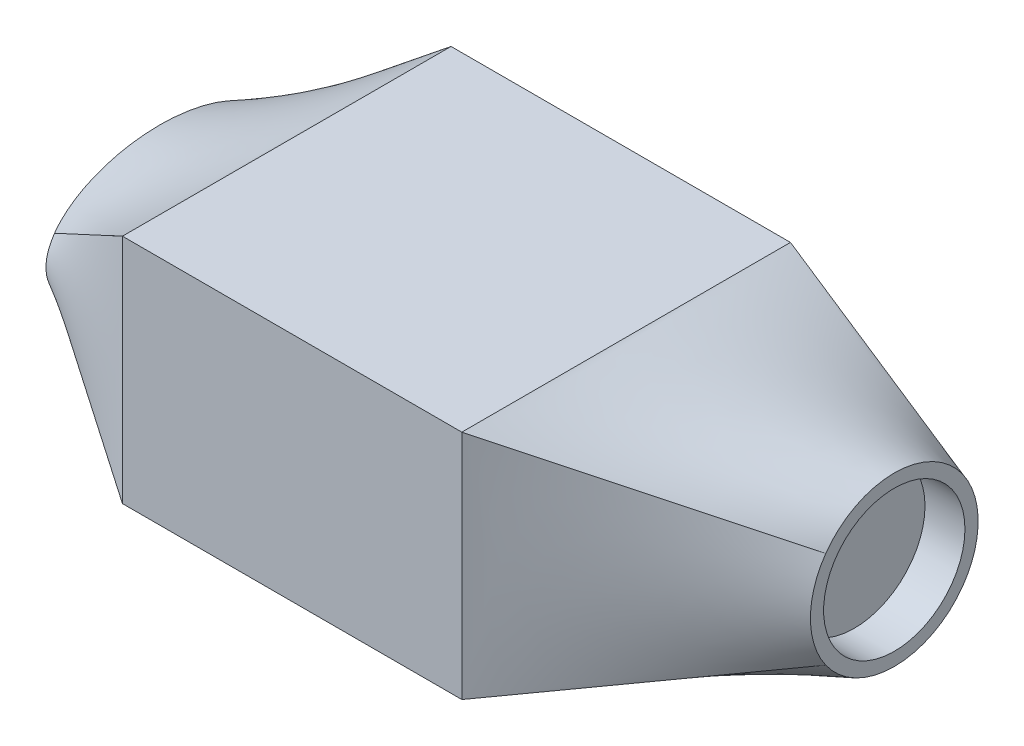
ISO-10303-21;
HEADER;
FILE_DESCRIPTION(('STEP AP214'),'2;1');
FILE_NAME('part.step','',(''),(''),'','','');
FILE_SCHEMA(('AUTOMOTIVE_DESIGN { 1 0 10303 214 1 1 1 1 }'));
ENDSEC;
DATA;
#1=APPLICATION_CONTEXT('core data for automotive mechanical design processes');
#2=APPLICATION_PROTOCOL_DEFINITION('international standard','automotive_design',2000,#1);
#3=PRODUCT_CONTEXT('',#1,'mechanical');
#4=PRODUCT('Part','Part','',(#3));
#5=PRODUCT_RELATED_PRODUCT_CATEGORY('part','',(#4));
#6=PRODUCT_DEFINITION_FORMATION('','',#4);
#7=PRODUCT_DEFINITION_CONTEXT('part definition',#1,'design');
#8=PRODUCT_DEFINITION('design','',#6,#7);
#9=PRODUCT_DEFINITION_SHAPE('','',#8);
#10=(LENGTH_UNIT() NAMED_UNIT(*) SI_UNIT(.MILLI.,.METRE.));
#11=(NAMED_UNIT(*) PLANE_ANGLE_UNIT() SI_UNIT($,.RADIAN.));
#12=(NAMED_UNIT(*) SI_UNIT($,.STERADIAN.) SOLID_ANGLE_UNIT());
#13=UNCERTAINTY_MEASURE_WITH_UNIT(LENGTH_MEASURE(1.E-05),#10,'distance_accuracy_value','');
#14=(GEOMETRIC_REPRESENTATION_CONTEXT(3) GLOBAL_UNCERTAINTY_ASSIGNED_CONTEXT((#13)) GLOBAL_UNIT_ASSIGNED_CONTEXT((#10,
#11,#12)) REPRESENTATION_CONTEXT('',''));
#15=CARTESIAN_POINT('',(0.,0.,0.));
#16=DIRECTION('',(0.,0.,1.));
#17=DIRECTION('',(1.,0.,0.));
#18=AXIS2_PLACEMENT_3D('',#15,#16,#17);
#19=CARTESIAN_POINT('',(0.,14.732,0.));
#20=DIRECTION('',(0.,0.,-1.));
#21=DIRECTION('',(-1.,0.,0.));
#22=AXIS2_PLACEMENT_3D('',#19,#20,#21);
#23=PLANE('',#22);
#24=DIRECTION('',(1.,0.,0.));
#25=VECTOR('',#24,1.);
#26=CARTESIAN_POINT('',(0.,0.,0.));
#27=LINE('',#26,#25);
#28=CARTESIAN_POINT('',(0.,0.,0.));
#29=VERTEX_POINT('',#28);
#30=CARTESIAN_POINT('',(21.59,0.,0.));
#31=VERTEX_POINT('',#30);
#32=EDGE_CURVE('E183',#29,#31,#27,.T.);
#33=ORIENTED_EDGE('',*,*,#32,.T.);
#34=DIRECTION('',(0.,1.,0.));
#35=VECTOR('',#34,1.);
#36=CARTESIAN_POINT('',(21.59,14.732,0.));
#37=LINE('',#36,#35);
#38=CARTESIAN_POINT('',(21.59,14.732,0.));
#39=VERTEX_POINT('',#38);
#40=EDGE_CURVE('E99',#39,#31,#37,.F.);
#41=ORIENTED_EDGE('',*,*,#40,.F.);
#42=DIRECTION('',(1.,0.,0.));
#43=VECTOR('',#42,1.);
#44=CARTESIAN_POINT('',(0.,14.732,0.));
#45=LINE('',#44,#43);
#46=CARTESIAN_POINT('',(0.,14.732,0.));
#47=VERTEX_POINT('',#46);
#48=EDGE_CURVE('E338',#47,#39,#45,.T.);
#49=ORIENTED_EDGE('',*,*,#48,.F.);
#50=DIRECTION('',(0.,1.,0.));
#51=VECTOR('',#50,1.);
#52=CARTESIAN_POINT('',(0.,14.732,0.));
#53=LINE('',#52,#51);
#54=EDGE_CURVE('E12',#47,#29,#53,.F.);
#55=ORIENTED_EDGE('',*,*,#54,.T.);
#56=EDGE_LOOP('',(#33,#41,#49,#55));
#57=FACE_BOUND('',#56,.T.);
#58=ADVANCED_FACE('F90',(#57),#23,.F.);
#59=CARTESIAN_POINT('',(0.,14.732,-20.9042));
#60=DIRECTION('',(0.,0.,1.));
#61=DIRECTION('',(1.,0.,0.));
#62=AXIS2_PLACEMENT_3D('',#59,#60,#61);
#63=PLANE('',#62);
#64=DIRECTION('',(-1.,0.,0.));
#65=VECTOR('',#64,1.);
#66=CARTESIAN_POINT('',(0.,0.,-20.9042));
#67=LINE('',#66,#65);
#68=CARTESIAN_POINT('',(21.5899999999999,0.,-20.9042));
#69=VERTEX_POINT('',#68);
#70=CARTESIAN_POINT('',(0.,0.,-20.9042));
#71=VERTEX_POINT('',#70);
#72=EDGE_CURVE('E182',#69,#71,#67,.T.);
#73=ORIENTED_EDGE('',*,*,#72,.T.);
#74=DIRECTION('',(0.,1.,0.));
#75=VECTOR('',#74,1.);
#76=CARTESIAN_POINT('',(0.,14.732,-20.9042));
#77=LINE('',#76,#75);
#78=CARTESIAN_POINT('',(0.,14.732,-20.9042));
#79=VERTEX_POINT('',#78);
#80=EDGE_CURVE('E195',#79,#71,#77,.F.);
#81=ORIENTED_EDGE('',*,*,#80,.F.);
#82=DIRECTION('',(-1.,0.,0.));
#83=VECTOR('',#82,1.);
#84=CARTESIAN_POINT('',(0.,14.732,-20.9042));
#85=LINE('',#84,#83);
#86=CARTESIAN_POINT('',(21.59,14.732,-20.9042));
#87=VERTEX_POINT('',#86);
#88=EDGE_CURVE('E209',#87,#79,#85,.T.);
#89=ORIENTED_EDGE('',*,*,#88,.F.);
#90=DIRECTION('',(0.,1.,0.));
#91=VECTOR('',#90,1.);
#92=CARTESIAN_POINT('',(21.59,14.732,-20.9042));
#93=LINE('',#92,#91);
#94=EDGE_CURVE('E198',#87,#69,#93,.F.);
#95=ORIENTED_EDGE('',*,*,#94,.T.);
#96=EDGE_LOOP('',(#73,#81,#89,#95));
#97=FACE_BOUND('',#96,.T.);
#98=ADVANCED_FACE('F193',(#97),#63,.F.);
#99=CARTESIAN_POINT('',(0.,14.732,0.));
#100=DIRECTION('',(0.,-1.,0.));
#101=DIRECTION('',(0.,0.,-1.));
#102=AXIS2_PLACEMENT_3D('',#99,#100,#101);
#103=PLANE('',#102);
#104=DIRECTION('',(0.,0.,-1.));
#105=VECTOR('',#104,1.);
#106=CARTESIAN_POINT('',(0.,14.732,0.));
#107=LINE('',#106,#105);
#108=EDGE_CURVE('E199',#79,#47,#107,.F.);
#109=ORIENTED_EDGE('',*,*,#108,.T.);
#110=ORIENTED_EDGE('',*,*,#48,.T.);
#111=DIRECTION('',(0.,0.,-1.));
#112=VECTOR('',#111,1.);
#113=CARTESIAN_POINT('',(21.59,14.732,0.));
#114=LINE('',#113,#112);
#115=EDGE_CURVE('E340',#39,#87,#114,.T.);
#116=ORIENTED_EDGE('',*,*,#115,.T.);
#117=ORIENTED_EDGE('',*,*,#88,.T.);
#118=EDGE_LOOP('',(#109,#110,#116,#117));
#119=FACE_BOUND('',#118,.T.);
#120=ADVANCED_FACE('F348',(#119),#103,.F.);
#121=CARTESIAN_POINT('',(0.,0.,0.));
#122=DIRECTION('',(0.,-1.,0.));
#123=DIRECTION('',(0.,0.,-1.));
#124=AXIS2_PLACEMENT_3D('',#121,#122,#123);
#125=PLANE('',#124);
#126=DIRECTION('',(0.,0.,-1.));
#127=VECTOR('',#126,1.);
#128=CARTESIAN_POINT('',(0.,0.,0.));
#129=LINE('',#128,#127);
#130=EDGE_CURVE('E179',#71,#29,#129,.F.);
#131=ORIENTED_EDGE('',*,*,#130,.F.);
#132=ORIENTED_EDGE('',*,*,#72,.F.);
#133=DIRECTION('',(0.,0.,-1.));
#134=VECTOR('',#133,1.);
#135=CARTESIAN_POINT('',(21.59,0.,0.));
#136=LINE('',#135,#134);
#137=EDGE_CURVE('E93',#31,#69,#136,.T.);
#138=ORIENTED_EDGE('',*,*,#137,.F.);
#139=ORIENTED_EDGE('',*,*,#32,.F.);
#140=EDGE_LOOP('',(#131,#132,#138,#139));
#141=FACE_BOUND('',#140,.T.);
#142=ADVANCED_FACE('F181',(#141),#125,.T.);
#143=CARTESIAN_POINT('',(-8.0772,7.366,-10.4521));
#144=DIRECTION('',(1.,0.,0.));
#145=DIRECTION('',(0.,0.,-1.));
#146=AXIS2_PLACEMENT_3D('',#143,#144,#145);
#147=PLANE('',#146);
#148=CARTESIAN_POINT('',(-8.0772,8.4785808231568,-4.46415357402047));
#149=CARTESIAN_POINT('',(-8.0772,8.63579900988457,-4.57495132408378));
#150=CARTESIAN_POINT('',(-8.0772,8.91326180356113,-4.81385160520775));
#151=CARTESIAN_POINT('',(-8.0772,9.49219053262774,-5.50209251933148));
#152=CARTESIAN_POINT('',(-8.0772,10.1175566434143,-6.67462637184881));
#153=CARTESIAN_POINT('',(-8.0772,10.6164106155847,-8.46533683717692));
#154=CARTESIAN_POINT('',(-8.0772,10.7890446922076,-10.4521));
#155=CARTESIAN_POINT('',(-8.0772,10.6164106155847,-12.4388631628231));
#156=CARTESIAN_POINT('',(-8.0772,10.1175566434143,-14.2295736281512));
#157=CARTESIAN_POINT('',(-8.0772,9.49219053262774,-15.4021074806685));
#158=CARTESIAN_POINT('',(-8.0772,8.91326180356113,-16.0903483947922));
#159=CARTESIAN_POINT('',(-8.0772,8.63579900988456,-16.3292486759162));
#160=CARTESIAN_POINT('',(-8.0772,8.4785808231568,-16.4400464259795));
#161=B_SPLINE_CURVE_WITH_KNOTS('',3,(#148,#149,#150,#151,#152,#153,#154,#155,#156,#157,#158,
#159,#160),.UNSPECIFIED.,.F.,.F.,(4,1,1,1,1,1,1,1,1,1,4),(-2.75102742465269,-2.60349853742047,
-2.45596965018824,-2.16091187572379,-1.86585410125935,-1.5707963267949,-1.27573855233045,
-0.980680777865999,-0.68562300340155,-0.538094116169325,-0.390565228937101),.UNSPECIFIED.);
#162=CARTESIAN_POINT('',(-8.0772,8.4785808231568,-4.46415357402047));
#163=VERTEX_POINT('',#162);
#164=CARTESIAN_POINT('',(-8.0772,8.4785808231568,-16.4400464259795));
#165=VERTEX_POINT('',#164);
#166=EDGE_CURVE('E541',#163,#165,#161,.T.);
#167=ORIENTED_EDGE('',*,*,#166,.F.);
#168=CARTESIAN_POINT('',(-8.0772,6.25341917684321,-4.46415357402047));
#169=CARTESIAN_POINT('',(-8.0772,6.34518834598243,-4.39948028349708));
#170=CARTESIAN_POINT('',(-8.0772,6.5442324940531,-4.27804347791198));
#171=CARTESIAN_POINT('',(-8.0772,6.91641259986534,-4.1214548159713));
#172=CARTESIAN_POINT('',(-8.0772,7.366,-4.04686345601914));
#173=CARTESIAN_POINT('',(-8.0772,7.81558740013467,-4.1214548159713));
#174=CARTESIAN_POINT('',(-8.0772,8.1877675059469,-4.27804347791199));
#175=CARTESIAN_POINT('',(-8.0772,8.38681165401758,-4.39948028349708));
#176=CARTESIAN_POINT('',(-8.0772,8.4785808231568,-4.46415357402047));
#177=B_SPLINE_CURVE_WITH_KNOTS('',3,(#168,#169,#170,#171,#172,#173,#174,#175,#176),
.UNSPECIFIED.,.F.,.F.,(4,1,1,1,1,1,4),(2.75102742465269,2.84866873188697,2.94631003912124,
3.14159265358979,3.33687526805834,3.43451657529262,3.53215788252689),.UNSPECIFIED.);
#178=CARTESIAN_POINT('',(-8.0772,6.25341917684321,-4.46415357402047));
#179=VERTEX_POINT('',#178);
#180=EDGE_CURVE('E108',#179,#163,#177,.T.);
#181=ORIENTED_EDGE('',*,*,#180,.F.);
#182=CARTESIAN_POINT('',(-8.0772,6.2534191768432,-16.4400464259795));
#183=CARTESIAN_POINT('',(-8.0772,6.09620099011544,-16.3292486759162));
#184=CARTESIAN_POINT('',(-8.0772,5.81873819643888,-16.0903483947922));
#185=CARTESIAN_POINT('',(-8.0772,5.23980946737226,-15.4021074806685));
#186=CARTESIAN_POINT('',(-8.0772,4.61444335658567,-14.2295736281512));
#187=CARTESIAN_POINT('',(-8.0772,4.11558938441529,-12.4388631628231));
#188=CARTESIAN_POINT('',(-8.0772,3.94295530779236,-10.4521));
#189=CARTESIAN_POINT('',(-8.0772,4.11558938441529,-8.46533683717692));
#190=CARTESIAN_POINT('',(-8.0772,4.61444335658567,-6.67462637184881));
#191=CARTESIAN_POINT('',(-8.0772,5.23980946737226,-5.50209251933148));
#192=CARTESIAN_POINT('',(-8.0772,5.81873819643888,-4.81385160520775));
#193=CARTESIAN_POINT('',(-8.0772,6.09620099011544,-4.57495132408378));
#194=CARTESIAN_POINT('',(-8.0772,6.25341917684321,-4.46415357402047));
#195=B_SPLINE_CURVE_WITH_KNOTS('',3,(#182,#183,#184,#185,#186,#187,#188,#189,#190,#191,#192,
#193,#194),.UNSPECIFIED.,.F.,.F.,(4,1,1,1,1,1,1,1,1,1,4),(0.390565228937101,0.538094116169325,
0.68562300340155,0.980680777865999,1.27573855233045,1.5707963267949,1.86585410125935,
2.1609118757238,2.45596965018824,2.60349853742047,2.75102742465269),.UNSPECIFIED.);
#196=CARTESIAN_POINT('',(-8.0772,6.2534191768432,-16.4400464259795));
#197=VERTEX_POINT('',#196);
#198=EDGE_CURVE('E502',#197,#179,#195,.T.);
#199=ORIENTED_EDGE('',*,*,#198,.F.);
#200=CARTESIAN_POINT('',(-8.0772,8.4785808231568,-16.4400464259795));
#201=CARTESIAN_POINT('',(-8.0772,8.38681165401758,-16.5047197165029));
#202=CARTESIAN_POINT('',(-8.0772,8.18776750594691,-16.626156522088));
#203=CARTESIAN_POINT('',(-8.0772,7.81558740013467,-16.7827451840287));
#204=CARTESIAN_POINT('',(-8.0772,7.366,-16.8573365439809));
#205=CARTESIAN_POINT('',(-8.0772,6.91641259986534,-16.7827451840287));
#206=CARTESIAN_POINT('',(-8.0772,6.5442324940531,-16.626156522088));
#207=CARTESIAN_POINT('',(-8.0772,6.34518834598243,-16.5047197165029));
#208=CARTESIAN_POINT('',(-8.0772,6.2534191768432,-16.4400464259795));
#209=B_SPLINE_CURVE_WITH_KNOTS('',3,(#200,#201,#202,#203,#204,#205,#206,#207,#208),
.UNSPECIFIED.,.F.,.F.,(4,1,1,1,1,1,4),(-0.390565228937101,-0.292923921702826,-0.19528261446855,
0.,0.19528261446855,0.292923921702826,0.390565228937101),.UNSPECIFIED.);
#210=EDGE_CURVE('E549',#165,#197,#209,.T.);
#211=ORIENTED_EDGE('',*,*,#210,.F.);
#212=EDGE_LOOP('',(#167,#181,#199,#211));
#213=FACE_BOUND('',#212,.T.);
#214=CARTESIAN_POINT('',(-8.0772,7.366,-10.4521));
#215=DIRECTION('',(1.,0.,0.));
#216=DIRECTION('',(0.,0.,-1.));
#217=AXIS2_PLACEMENT_3D('',#214,#215,#216);
#218=ELLIPSE('',#217,7.239,4.2291);
#219=CARTESIAN_POINT('',(-8.0772,8.97606548102425,-3.75823999914993));
#220=VERTEX_POINT('',#219);
#221=CARTESIAN_POINT('',(-8.0772,5.75593451897576,-3.75823999914993));
#222=VERTEX_POINT('',#221);
#223=EDGE_CURVE('E187',#220,#222,#218,.T.);
#224=ORIENTED_EDGE('',*,*,#223,.F.);
#225=CARTESIAN_POINT('',(-8.0772,8.97606548102425,-17.1459600008501));
#226=VERTEX_POINT('',#225);
#227=EDGE_CURVE('E287',#226,#220,#218,.T.);
#228=ORIENTED_EDGE('',*,*,#227,.F.);
#229=CARTESIAN_POINT('',(-8.0772,5.75593451897575,-17.1459600008501));
#230=VERTEX_POINT('',#229);
#231=EDGE_CURVE('E317',#230,#226,#218,.T.);
#232=ORIENTED_EDGE('',*,*,#231,.F.);
#233=EDGE_CURVE('E213',#222,#230,#218,.T.);
#234=ORIENTED_EDGE('',*,*,#233,.F.);
#235=EDGE_LOOP('',(#224,#228,#232,#234));
#236=FACE_BOUND('',#235,.T.);
#237=ADVANCED_FACE('F290',(#213,#236),#147,.F.);
#238=CARTESIAN_POINT('',(-8.0772,8.97606548102425,-3.75823999914993));
#239=CARTESIAN_POINT('',(0.,14.732,0.));
#240=CARTESIAN_POINT('',(-8.0772,8.72792916104042,-3.58336871653678));
#241=CARTESIAN_POINT('',(0.,13.5043333333333,0.));
#242=CARTESIAN_POINT('',(-8.0772,8.46521987994628,-3.44593680752527));
#243=CARTESIAN_POINT('',(0.,12.2766666666667,0.));
#244=CARTESIAN_POINT('',(-8.0772,7.92363475004104,-3.2607541856138));
#245=CARTESIAN_POINT('',(0.,9.82133333333335,0.));
#246=CARTESIAN_POINT('',(-8.0772,7.64484354005384,-3.2131));
#247=CARTESIAN_POINT('',(0.,8.59366666666669,0.));
#248=CARTESIAN_POINT('',(-8.0772,7.08715645994617,-3.2131));
#249=CARTESIAN_POINT('',(0.,6.13833333333336,0.));
#250=CARTESIAN_POINT('',(-8.0772,6.80836524995897,-3.2607541856138));
#251=CARTESIAN_POINT('',(0.,4.91066666666669,0.));
#252=CARTESIAN_POINT('',(-8.0772,6.26678012005373,-3.44593680752527));
#253=CARTESIAN_POINT('',(0.,2.45533333333335,0.));
#254=CARTESIAN_POINT('',(-8.0772,6.00407083895958,-3.58336871653678));
#255=CARTESIAN_POINT('',(0.,1.22766666666668,0.));
#256=CARTESIAN_POINT('',(-8.0772,5.75593451897575,-3.75823999914993));
#257=CARTESIAN_POINT('',(0.,0.,0.));
#258=B_SPLINE_SURFACE_WITH_KNOTS('',3,1,((#238,#239),(#240,#241),(#242,#243),(#244,#245),(#246,
#247),(#248,#249),(#250,#251),(#252,#253),(#254,#255),(#256,#257)),.UNSPECIFIED.,.F.,.F.,.F.,(4,
2,2,2,4),(2,2),(0.,0.25,0.499999999999999,0.75,1.),(0.,1.),.UNSPECIFIED.);
#259=DIRECTION('',(0.761538208673422,-0.542683611006575,0.354336076451919));
#260=VECTOR('',#259,1.);
#261=CARTESIAN_POINT('',(-4.0386,2.87796725948788,-1.87911999957496));
#262=LINE('',#261,#260);
#263=EDGE_CURVE('E218',#222,#29,#262,.T.);
#264=DIRECTION('',(-0.761538208673422,-0.542683611006575,-0.354336076451919));
#265=VECTOR('',#264,1.);
#266=CARTESIAN_POINT('',(-4.0386,11.8540327405121,-1.87911999957496));
#267=LINE('',#266,#265);
#268=EDGE_CURVE('E215',#47,#220,#267,.T.);
#269=ORIENTED_EDGE('',*,*,#223,.T.);
#270=ORIENTED_EDGE('',*,*,#263,.T.);
#271=ORIENTED_EDGE('',*,*,#54,.F.);
#272=ORIENTED_EDGE('',*,*,#268,.T.);
#273=EDGE_LOOP('',(#269,#270,#271,#272));
#274=FACE_BOUND('',#273,.T.);
#275=ADVANCED_FACE('F244',(#274),#258,.T.);
#276=CARTESIAN_POINT('',(-8.0772,5.75593451897575,-3.75823999914993));
#277=CARTESIAN_POINT('',(0.,0.,0.));
#278=CARTESIAN_POINT('',(-8.0772,5.45459034100223,-3.97060892165861));
#279=CARTESIAN_POINT('',(0.,0.,-0.871008333333335));
#280=CARTESIAN_POINT('',(-8.0772,5.14334135413498,-4.25977922271405));
#281=CARTESIAN_POINT('',(0.,0.,-1.74201666666667));
#282=CARTESIAN_POINT('',(-8.0772,4.538567004302,-5.03026802808843));
#283=CARTESIAN_POINT('',(0.,0.,-3.48403333333334));
#284=CARTESIAN_POINT('',(-8.0772,4.24531729870388,-5.51275379015806));
#285=CARTESIAN_POINT('',(0.,0.,-4.35504166666667));
#286=CARTESIAN_POINT('',(-8.0772,3.73410147590328,-6.67283390494814));
#287=CARTESIAN_POINT('',(0.,0.,-6.09705833333334));
#288=CARTESIAN_POINT('',(-8.0772,3.517113038355,-7.3510168470026));
#289=CARTESIAN_POINT('',(0.,0.,-6.96806666666667));
#290=CARTESIAN_POINT('',(-8.0772,3.21797407539007,-8.83726003364382));
#291=CARTESIAN_POINT('',(0.,0.,-8.71008333333334));
#292=CARTESIAN_POINT('',(-8.0772,3.1369,-9.64407919001748));
#293=CARTESIAN_POINT('',(0.,0.,-9.58109166666668));
#294=CARTESIAN_POINT('',(-8.0772,3.1369,-11.2601208099825));
#295=CARTESIAN_POINT('',(0.,0.,-11.3231083333333));
#296=CARTESIAN_POINT('',(-8.0772,3.21797407539007,-12.0669399663562));
#297=CARTESIAN_POINT('',(0.,0.,-12.1941166666667));
#298=CARTESIAN_POINT('',(-8.0772,3.517113038355,-13.5531831529974));
#299=CARTESIAN_POINT('',(0.,0.,-13.9361333333333));
#300=CARTESIAN_POINT('',(-8.0772,3.73410147590328,-14.2313660950519));
#301=CARTESIAN_POINT('',(0.,0.,-14.8071416666667));
#302=CARTESIAN_POINT('',(-8.0772,4.24531729870388,-15.3914462098419));
#303=CARTESIAN_POINT('',(0.,0.,-16.5491583333333));
#304=CARTESIAN_POINT('',(-8.0772,4.538567004302,-15.8739319719116));
#305=CARTESIAN_POINT('',(0.,0.,-17.4201666666667));
#306=CARTESIAN_POINT('',(-8.0772,5.14334135413498,-16.6444207772859));
#307=CARTESIAN_POINT('',(0.,0.,-19.1621833333333));
#308=CARTESIAN_POINT('',(-8.0772,5.45459034100222,-16.9335910783414));
#309=CARTESIAN_POINT('',(0.,0.,-20.0331916666667));
#310=CARTESIAN_POINT('',(-8.0772,5.75593451897575,-17.1459600008501));
#311=CARTESIAN_POINT('',(0.,0.,-20.9042));
#312=B_SPLINE_SURFACE_WITH_KNOTS('',3,1,((#276,#277),(#278,#279),(#280,#281),(#282,#283),(#284,
#285),(#286,#287),(#288,#289),(#290,#291),(#292,#293),(#294,#295),(#296,#297),(#298,#299),(#300,
#301),(#302,#303),(#304,#305),(#306,#307),(#308,#309),(#310,#311)),.UNSPECIFIED.,.F.,.F.,.F.,(4,
2,2,2,2,2,2,2,4),(2,2),(0.,0.125,0.25,0.375,0.5,0.625,0.75,0.875,1.),(0.,1.),.UNSPECIFIED.);
#313=DIRECTION('',(0.761538208673422,-0.542683611006575,-0.354336076451919));
#314=VECTOR('',#313,1.);
#315=CARTESIAN_POINT('',(-4.0386,2.87796725948788,-19.025080000425));
#316=LINE('',#315,#314);
#317=EDGE_CURVE('E204',#230,#71,#316,.T.);
#318=ORIENTED_EDGE('',*,*,#233,.T.);
#319=ORIENTED_EDGE('',*,*,#317,.T.);
#320=ORIENTED_EDGE('',*,*,#130,.T.);
#321=ORIENTED_EDGE('',*,*,#263,.F.);
#322=EDGE_LOOP('',(#318,#319,#320,#321));
#323=FACE_BOUND('',#322,.T.);
#324=ADVANCED_FACE('F211',(#323),#312,.T.);
#325=CARTESIAN_POINT('',(-8.0772,8.97606548102425,-17.1459600008501));
#326=CARTESIAN_POINT('',(0.,14.732,-20.9042));
#327=CARTESIAN_POINT('',(-8.0772,9.27740965899778,-16.9335910783414));
#328=CARTESIAN_POINT('',(0.,14.732,-20.0331916666667));
#329=CARTESIAN_POINT('',(-8.0772,9.58865864586503,-16.6444207772859));
#330=CARTESIAN_POINT('',(0.,14.732,-19.1621833333333));
#331=CARTESIAN_POINT('',(-8.0772,10.193432995698,-15.8739319719116));
#332=CARTESIAN_POINT('',(0.,14.732,-17.4201666666667));
#333=CARTESIAN_POINT('',(-8.0772,10.4866827012961,-15.3914462098419));
#334=CARTESIAN_POINT('',(0.,14.732,-16.5491583333333));
#335=CARTESIAN_POINT('',(-8.0772,10.9978985240967,-14.2313660950519));
#336=CARTESIAN_POINT('',(0.,14.732,-14.8071416666667));
#337=CARTESIAN_POINT('',(-8.0772,11.214886961645,-13.5531831529974));
#338=CARTESIAN_POINT('',(0.,14.732,-13.9361333333333));
#339=CARTESIAN_POINT('',(-8.0772,11.5140259246099,-12.0669399663562));
#340=CARTESIAN_POINT('',(0.,14.732,-12.1941166666667));
#341=CARTESIAN_POINT('',(-8.0772,11.5951,-11.2601208099825));
#342=CARTESIAN_POINT('',(0.,14.732,-11.3231083333333));
#343=CARTESIAN_POINT('',(-8.0772,11.5951,-9.64407919001748));
#344=CARTESIAN_POINT('',(0.,14.732,-9.58109166666665));
#345=CARTESIAN_POINT('',(-8.0772,11.5140259246099,-8.83726003364382));
#346=CARTESIAN_POINT('',(0.,14.732,-8.71008333333332));
#347=CARTESIAN_POINT('',(-8.0772,11.214886961645,-7.35101684700261));
#348=CARTESIAN_POINT('',(0.,14.732,-6.96806666666665));
#349=CARTESIAN_POINT('',(-8.0772,10.9978985240967,-6.67283390494814));
#350=CARTESIAN_POINT('',(0.,14.732,-6.09705833333332));
#351=CARTESIAN_POINT('',(-8.0772,10.4866827012961,-5.51275379015806));
#352=CARTESIAN_POINT('',(0.,14.732,-4.35504166666666));
#353=CARTESIAN_POINT('',(-8.0772,10.193432995698,-5.03026802808843));
#354=CARTESIAN_POINT('',(0.,14.732,-3.48403333333332));
#355=CARTESIAN_POINT('',(-8.0772,9.58865864586503,-4.25977922271405));
#356=CARTESIAN_POINT('',(0.,14.732,-1.74201666666666));
#357=CARTESIAN_POINT('',(-8.0772,9.27740965899778,-3.97060892165861));
#358=CARTESIAN_POINT('',(0.,14.732,-0.871008333333331));
#359=CARTESIAN_POINT('',(-8.0772,8.97606548102425,-3.75823999914993));
#360=CARTESIAN_POINT('',(0.,14.732,0.));
#361=B_SPLINE_SURFACE_WITH_KNOTS('',3,1,((#325,#326),(#327,#328),(#329,#330),(#331,#332),(#333,
#334),(#335,#336),(#337,#338),(#339,#340),(#341,#342),(#343,#344),(#345,#346),(#347,#348),(#349,
#350),(#351,#352),(#353,#354),(#355,#356),(#357,#358),(#359,#360)),.UNSPECIFIED.,.F.,.F.,.F.,(4,
2,2,2,2,2,2,2,4),(2,2),(0.,0.125,0.25,0.375,0.5,0.625,0.75,0.875,1.),(0.,1.),.UNSPECIFIED.);
#362=DIRECTION('',(0.761538208673422,0.542683611006575,-0.354336076451919));
#363=VECTOR('',#362,1.);
#364=CARTESIAN_POINT('',(-4.0386,11.8540327405121,-19.025080000425));
#365=LINE('',#364,#363);
#366=EDGE_CURVE('E207',#226,#79,#365,.T.);
#367=ORIENTED_EDGE('',*,*,#227,.T.);
#368=ORIENTED_EDGE('',*,*,#268,.F.);
#369=ORIENTED_EDGE('',*,*,#108,.F.);
#370=ORIENTED_EDGE('',*,*,#366,.F.);
#371=EDGE_LOOP('',(#367,#368,#369,#370));
#372=FACE_BOUND('',#371,.T.);
#373=ADVANCED_FACE('F243',(#372),#361,.T.);
#374=CARTESIAN_POINT('',(-8.0772,5.75593451897575,-17.1459600008501));
#375=CARTESIAN_POINT('',(0.,0.,-20.9042));
#376=CARTESIAN_POINT('',(-8.0772,6.00407083895958,-17.3208312834632));
#377=CARTESIAN_POINT('',(0.,1.22766666666667,-20.9042));
#378=CARTESIAN_POINT('',(-8.0772,6.26678012005373,-17.4582631924747));
#379=CARTESIAN_POINT('',(0.,2.45533333333333,-20.9042));
#380=CARTESIAN_POINT('',(-8.0772,6.80836524995896,-17.6434458143862));
#381=CARTESIAN_POINT('',(0.,4.91066666666666,-20.9042));
#382=CARTESIAN_POINT('',(-8.0772,7.08715645994617,-17.6911));
#383=CARTESIAN_POINT('',(0.,6.13833333333333,-20.9042));
#384=CARTESIAN_POINT('',(-8.0772,7.64484354005384,-17.6911));
#385=CARTESIAN_POINT('',(0.,8.59366666666666,-20.9042));
#386=CARTESIAN_POINT('',(-8.0772,7.92363475004104,-17.6434458143862));
#387=CARTESIAN_POINT('',(0.,9.82133333333333,-20.9042));
#388=CARTESIAN_POINT('',(-8.0772,8.46521987994628,-17.4582631924747));
#389=CARTESIAN_POINT('',(0.,12.2766666666667,-20.9042));
#390=CARTESIAN_POINT('',(-8.0772,8.72792916104043,-17.3208312834632));
#391=CARTESIAN_POINT('',(0.,13.5043333333333,-20.9042));
#392=CARTESIAN_POINT('',(-8.0772,8.97606548102425,-17.1459600008501));
#393=CARTESIAN_POINT('',(0.,14.732,-20.9042));
#394=B_SPLINE_SURFACE_WITH_KNOTS('',3,1,((#374,#375),(#376,#377),(#378,#379),(#380,#381),(#382,
#383),(#384,#385),(#386,#387),(#388,#389),(#390,#391),(#392,#393)),.UNSPECIFIED.,.F.,.F.,.F.,(4,
2,2,2,4),(2,2),(0.,0.25,0.5,0.75,1.),(0.,1.),.UNSPECIFIED.);
#395=ORIENTED_EDGE('',*,*,#231,.T.);
#396=ORIENTED_EDGE('',*,*,#366,.T.);
#397=ORIENTED_EDGE('',*,*,#80,.T.);
#398=ORIENTED_EDGE('',*,*,#317,.F.);
#399=EDGE_LOOP('',(#395,#396,#397,#398));
#400=FACE_BOUND('',#399,.T.);
#401=ADVANCED_FACE('F203',(#400),#394,.T.);
#402=CARTESIAN_POINT('',(0.,6.25341917684321,-4.46415357402047));
#403=CARTESIAN_POINT('',(0.,6.34518834598243,-4.39948028349708));
#404=CARTESIAN_POINT('',(0.,6.5442324940531,-4.27804347791198));
#405=CARTESIAN_POINT('',(0.,6.91641259986534,-4.1214548159713));
#406=CARTESIAN_POINT('',(0.,7.366,-4.04686345601914));
#407=CARTESIAN_POINT('',(0.,7.81558740013467,-4.1214548159713));
#408=CARTESIAN_POINT('',(0.,8.1877675059469,-4.27804347791199));
#409=CARTESIAN_POINT('',(0.,8.38681165401758,-4.39948028349708));
#410=CARTESIAN_POINT('',(0.,8.4785808231568,-4.46415357402047));
#411=B_SPLINE_CURVE_WITH_KNOTS('',3,(#402,#403,#404,#405,#406,#407,#408,#409,#410),
.UNSPECIFIED.,.F.,.F.,(4,1,1,1,1,1,4),(2.75102742465269,2.84866873188697,2.94631003912124,
3.14159265358979,3.33687526805834,3.43451657529262,3.53215788252689),.UNSPECIFIED.);
#412=DIRECTION('',(-1.,0.,0.));
#413=VECTOR('',#412,1.);
#414=SURFACE_OF_LINEAR_EXTRUSION('',#411,#413);
#415=ORIENTED_EDGE('',*,*,#180,.T.);
#416=DIRECTION('',(-1.,0.,0.));
#417=VECTOR('',#416,1.);
#418=CARTESIAN_POINT('',(0.,8.4785808231568,-4.46415357402047));
#419=LINE('',#418,#417);
#420=CARTESIAN_POINT('',(0.,8.4785808231568,-4.46415357402047));
#421=VERTEX_POINT('',#420);
#422=EDGE_CURVE('E327',#421,#163,#419,.T.);
#423=ORIENTED_EDGE('',*,*,#422,.F.);
#424=CARTESIAN_POINT('',(0.,6.25341917684321,-4.46415357402047));
#425=VERTEX_POINT('',#424);
#426=EDGE_CURVE('E490',#425,#421,#411,.T.);
#427=ORIENTED_EDGE('',*,*,#426,.F.);
#428=DIRECTION('',(-1.,0.,0.));
#429=VECTOR('',#428,1.);
#430=CARTESIAN_POINT('',(0.,6.25341917684321,-4.46415357402047));
#431=LINE('',#430,#429);
#432=EDGE_CURVE('E220',#425,#179,#431,.T.);
#433=ORIENTED_EDGE('',*,*,#432,.T.);
#434=EDGE_LOOP('',(#415,#423,#427,#433));
#435=FACE_BOUND('',#434,.T.);
#436=ADVANCED_FACE('F300',(#435),#414,.F.);
#437=CARTESIAN_POINT('',(0.,6.2534191768432,-16.4400464259795));
#438=CARTESIAN_POINT('',(0.,6.09620099011544,-16.3292486759162));
#439=CARTESIAN_POINT('',(0.,5.81873819643888,-16.0903483947922));
#440=CARTESIAN_POINT('',(0.,5.23980946737226,-15.4021074806685));
#441=CARTESIAN_POINT('',(0.,4.61444335658567,-14.2295736281512));
#442=CARTESIAN_POINT('',(0.,4.11558938441529,-12.4388631628231));
#443=CARTESIAN_POINT('',(0.,3.94295530779236,-10.4521));
#444=CARTESIAN_POINT('',(0.,4.11558938441529,-8.46533683717692));
#445=CARTESIAN_POINT('',(0.,4.61444335658567,-6.67462637184881));
#446=CARTESIAN_POINT('',(0.,5.23980946737226,-5.50209251933148));
#447=CARTESIAN_POINT('',(0.,5.81873819643888,-4.81385160520775));
#448=CARTESIAN_POINT('',(0.,6.09620099011544,-4.57495132408378));
#449=CARTESIAN_POINT('',(0.,6.25341917684321,-4.46415357402047));
#450=B_SPLINE_CURVE_WITH_KNOTS('',3,(#437,#438,#439,#440,#441,#442,#443,#444,#445,#446,#447,
#448,#449),.UNSPECIFIED.,.F.,.F.,(4,1,1,1,1,1,1,1,1,1,4),(0.390565228937101,0.538094116169325,
0.68562300340155,0.980680777865999,1.27573855233045,1.5707963267949,1.86585410125935,
2.1609118757238,2.45596965018824,2.60349853742047,2.75102742465269),.UNSPECIFIED.);
#451=DIRECTION('',(-1.,0.,0.));
#452=VECTOR('',#451,1.);
#453=SURFACE_OF_LINEAR_EXTRUSION('',#450,#452);
#454=ORIENTED_EDGE('',*,*,#198,.T.);
#455=ORIENTED_EDGE('',*,*,#432,.F.);
#456=CARTESIAN_POINT('',(0.,6.2534191768432,-16.4400464259795));
#457=VERTEX_POINT('',#456);
#458=EDGE_CURVE('E529',#457,#425,#450,.T.);
#459=ORIENTED_EDGE('',*,*,#458,.F.);
#460=DIRECTION('',(-1.,0.,0.));
#461=VECTOR('',#460,1.);
#462=CARTESIAN_POINT('',(0.,6.2534191768432,-16.4400464259795));
#463=LINE('',#462,#461);
#464=EDGE_CURVE('E568',#457,#197,#463,.T.);
#465=ORIENTED_EDGE('',*,*,#464,.T.);
#466=EDGE_LOOP('',(#454,#455,#459,#465));
#467=FACE_BOUND('',#466,.T.);
#468=ADVANCED_FACE('F525',(#467),#453,.F.);
#469=CARTESIAN_POINT('',(0.,8.4785808231568,-16.4400464259795));
#470=CARTESIAN_POINT('',(0.,8.38681165401758,-16.5047197165029));
#471=CARTESIAN_POINT('',(0.,8.18776750594691,-16.626156522088));
#472=CARTESIAN_POINT('',(0.,7.81558740013467,-16.7827451840287));
#473=CARTESIAN_POINT('',(0.,7.366,-16.8573365439809));
#474=CARTESIAN_POINT('',(0.,6.91641259986534,-16.7827451840287));
#475=CARTESIAN_POINT('',(0.,6.5442324940531,-16.626156522088));
#476=CARTESIAN_POINT('',(0.,6.34518834598243,-16.5047197165029));
#477=CARTESIAN_POINT('',(0.,6.2534191768432,-16.4400464259795));
#478=B_SPLINE_CURVE_WITH_KNOTS('',3,(#469,#470,#471,#472,#473,#474,#475,#476,#477),
.UNSPECIFIED.,.F.,.F.,(4,1,1,1,1,1,4),(-0.390565228937101,-0.292923921702826,-0.19528261446855,
0.,0.19528261446855,0.292923921702826,0.390565228937101),.UNSPECIFIED.);
#479=DIRECTION('',(-1.,0.,0.));
#480=VECTOR('',#479,1.);
#481=SURFACE_OF_LINEAR_EXTRUSION('',#478,#480);
#482=ORIENTED_EDGE('',*,*,#210,.T.);
#483=ORIENTED_EDGE('',*,*,#464,.F.);
#484=CARTESIAN_POINT('',(0.,8.4785808231568,-16.4400464259795));
#485=VERTEX_POINT('',#484);
#486=EDGE_CURVE('E511',#485,#457,#478,.T.);
#487=ORIENTED_EDGE('',*,*,#486,.F.);
#488=DIRECTION('',(-1.,0.,0.));
#489=VECTOR('',#488,1.);
#490=CARTESIAN_POINT('',(0.,8.4785808231568,-16.4400464259795));
#491=LINE('',#490,#489);
#492=EDGE_CURVE('E569',#485,#165,#491,.T.);
#493=ORIENTED_EDGE('',*,*,#492,.T.);
#494=EDGE_LOOP('',(#482,#483,#487,#493));
#495=FACE_BOUND('',#494,.T.);
#496=ADVANCED_FACE('F522',(#495),#481,.F.);
#497=CARTESIAN_POINT('',(0.,8.4785808231568,-4.46415357402047));
#498=CARTESIAN_POINT('',(0.,8.63579900988457,-4.57495132408378));
#499=CARTESIAN_POINT('',(0.,8.91326180356113,-4.81385160520775));
#500=CARTESIAN_POINT('',(0.,9.49219053262774,-5.50209251933148));
#501=CARTESIAN_POINT('',(0.,10.1175566434143,-6.67462637184881));
#502=CARTESIAN_POINT('',(0.,10.6164106155847,-8.46533683717692));
#503=CARTESIAN_POINT('',(0.,10.7890446922076,-10.4521));
#504=CARTESIAN_POINT('',(0.,10.6164106155847,-12.4388631628231));
#505=CARTESIAN_POINT('',(0.,10.1175566434143,-14.2295736281512));
#506=CARTESIAN_POINT('',(0.,9.49219053262774,-15.4021074806685));
#507=CARTESIAN_POINT('',(0.,8.91326180356113,-16.0903483947922));
#508=CARTESIAN_POINT('',(0.,8.63579900988456,-16.3292486759162));
#509=CARTESIAN_POINT('',(0.,8.4785808231568,-16.4400464259795));
#510=B_SPLINE_CURVE_WITH_KNOTS('',3,(#497,#498,#499,#500,#501,#502,#503,#504,#505,#506,#507,
#508,#509),.UNSPECIFIED.,.F.,.F.,(4,1,1,1,1,1,1,1,1,1,4),(-2.75102742465269,-2.60349853742047,
-2.45596965018824,-2.16091187572379,-1.86585410125935,-1.5707963267949,-1.27573855233045,
-0.980680777865999,-0.68562300340155,-0.538094116169325,-0.390565228937101),.UNSPECIFIED.);
#511=DIRECTION('',(-1.,0.,0.));
#512=VECTOR('',#511,1.);
#513=SURFACE_OF_LINEAR_EXTRUSION('',#510,#512);
#514=ORIENTED_EDGE('',*,*,#166,.T.);
#515=ORIENTED_EDGE('',*,*,#492,.F.);
#516=EDGE_CURVE('E501',#421,#485,#510,.T.);
#517=ORIENTED_EDGE('',*,*,#516,.F.);
#518=ORIENTED_EDGE('',*,*,#422,.T.);
#519=EDGE_LOOP('',(#514,#515,#517,#518));
#520=FACE_BOUND('',#519,.T.);
#521=ADVANCED_FACE('F519',(#520),#513,.F.);
#522=CARTESIAN_POINT('',(0.,7.366,-4.0767));
#523=DIRECTION('',(1.,0.,0.));
#524=DIRECTION('',(0.,0.,-1.));
#525=AXIS2_PLACEMENT_3D('',#522,#523,#524);
#526=PLANE('',#525);
#527=ORIENTED_EDGE('',*,*,#426,.T.);
#528=ORIENTED_EDGE('',*,*,#516,.T.);
#529=ORIENTED_EDGE('',*,*,#486,.T.);
#530=ORIENTED_EDGE('',*,*,#458,.T.);
#531=EDGE_LOOP('',(#527,#528,#529,#530));
#532=FACE_BOUND('',#531,.T.);
#533=ADVANCED_FACE('F476',(#532),#526,.F.);
#534=CARTESIAN_POINT('',(33.528,5.334,-15.5702));
#535=DIRECTION('',(1.,0.,0.));
#536=DIRECTION('',(0.,0.,-1.));
#537=AXIS2_PLACEMENT_3D('',#534,#535,#536);
#538=PLANE('',#537);
#539=CARTESIAN_POINT('',(33.528,5.334,-15.5702));
#540=DIRECTION('',(1.,0.,0.));
#541=DIRECTION('',(0.,0.,-1.));
#542=AXIS2_PLACEMENT_3D('',#539,#540,#541);
#543=CIRCLE('',#542,4.4958);
#544=CARTESIAN_POINT('',(33.528,5.334,-20.066));
#545=VERTEX_POINT('',#544);
#546=EDGE_CURVE('E372',#545,#545,#543,.T.);
#547=ORIENTED_EDGE('',*,*,#546,.F.);
#548=EDGE_LOOP('',(#547));
#549=FACE_BOUND('',#548,.T.);
#550=CARTESIAN_POINT('',(33.528,5.334,-15.5702));
#551=DIRECTION('',(1.,0.,0.));
#552=DIRECTION('',(0.,0.,-1.));
#553=AXIS2_PLACEMENT_3D('',#550,#551,#552);
#554=CIRCLE('',#553,5.334);
#555=CARTESIAN_POINT('',(33.528,2.26130064258339,-11.2101455669761));
#556=VERTEX_POINT('',#555);
#557=CARTESIAN_POINT('',(33.528,2.26130064258339,-19.9302544330239));
#558=VERTEX_POINT('',#557);
#559=EDGE_CURVE('E141',#556,#558,#554,.T.);
#560=ORIENTED_EDGE('',*,*,#559,.T.);
#561=CARTESIAN_POINT('',(33.528,8.40669935741661,-19.9302544330239));
#562=VERTEX_POINT('',#561);
#563=EDGE_CURVE('E368',#558,#562,#554,.T.);
#564=ORIENTED_EDGE('',*,*,#563,.T.);
#565=CARTESIAN_POINT('',(33.528,8.40669935741661,-11.2101455669761));
#566=VERTEX_POINT('',#565);
#567=EDGE_CURVE('E363',#562,#566,#554,.T.);
#568=ORIENTED_EDGE('',*,*,#567,.T.);
#569=EDGE_CURVE('E390',#566,#556,#554,.T.);
#570=ORIENTED_EDGE('',*,*,#569,.T.);
#571=EDGE_LOOP('',(#560,#564,#568,#570));
#572=FACE_BOUND('',#571,.T.);
#573=ADVANCED_FACE('F409',(#549,#572),#538,.T.);
#574=CARTESIAN_POINT('',(21.59,14.732,0.));
#575=CARTESIAN_POINT('',(33.528,8.40669935741661,-11.2101455669761));
#576=CARTESIAN_POINT('',(21.59,13.5043333333333,0.));
#577=CARTESIAN_POINT('',(33.528,7.9880911692322,-10.9151361512447));
#578=CARTESIAN_POINT('',(21.59,12.2766666666667,0.));
#579=CARTESIAN_POINT('',(33.528,7.50609873141237,-10.6675702130204));
#580=CARTESIAN_POINT('',(21.59,9.82133333333332,0.));
#581=CARTESIAN_POINT('',(33.528,6.46045946552322,-10.3275975165272));
#582=CARTESIAN_POINT('',(21.59,8.59366666666666,0.));
#583=CARTESIAN_POINT('',(33.528,5.89756806073582,-10.2362));
#584=CARTESIAN_POINT('',(21.59,6.13833333333332,0.));
#585=CARTESIAN_POINT('',(33.528,4.77043193926418,-10.2362));
#586=CARTESIAN_POINT('',(21.59,4.91066666666666,0.));
#587=CARTESIAN_POINT('',(33.528,4.20754053447678,-10.3275975165272));
#588=CARTESIAN_POINT('',(21.59,2.45533333333333,0.));
#589=CARTESIAN_POINT('',(33.528,3.16190126858763,-10.6675702130204));
#590=CARTESIAN_POINT('',(21.59,1.22766666666666,0.));
#591=CARTESIAN_POINT('',(33.528,2.67990883076781,-10.9151361512447));
#592=CARTESIAN_POINT('',(21.59,0.,0.));
#593=CARTESIAN_POINT('',(33.528,2.26130064258339,-11.2101455669761));
#594=B_SPLINE_SURFACE_WITH_KNOTS('',3,1,((#574,#575),(#576,#577),(#578,#579),(#580,#581),(#582,
#583),(#584,#585),(#586,#587),(#588,#589),(#590,#591),(#592,#593)),.UNSPECIFIED.,.F.,.F.,.F.,(4,
2,2,2,4),(2,2),(0.,0.25,0.5,0.75,1.),(0.,1.),.UNSPECIFIED.);
#595=DIRECTION('',(0.722128341318767,0.136785833661569,-0.678100504625764));
#596=VECTOR('',#595,1.);
#597=CARTESIAN_POINT('',(27.559,1.13065032129169,-5.60507278348804));
#598=LINE('',#597,#596);
#599=EDGE_CURVE('E378',#31,#556,#598,.T.);
#600=DIRECTION('',(-0.680018058514467,0.360304796656883,0.638557666620844));
#601=VECTOR('',#600,1.);
#602=CARTESIAN_POINT('',(27.559,11.5693496787083,-5.60507278348804));
#603=LINE('',#602,#601);
#604=EDGE_CURVE('E366',#566,#39,#603,.T.);
#605=ORIENTED_EDGE('',*,*,#40,.T.);
#606=ORIENTED_EDGE('',*,*,#599,.T.);
#607=ORIENTED_EDGE('',*,*,#569,.F.);
#608=ORIENTED_EDGE('',*,*,#604,.T.);
#609=EDGE_LOOP('',(#605,#606,#607,#608));
#610=FACE_BOUND('',#609,.T.);
#611=ADVANCED_FACE('F396',(#610),#594,.T.);
#612=CARTESIAN_POINT('',(21.59,0.,0.));
#613=CARTESIAN_POINT('',(33.528,2.26130064258339,-11.2101455669761));
#614=CARTESIAN_POINT('',(21.59,0.,-0.871008333333333));
#615=CARTESIAN_POINT('',(33.528,1.9643053504491,-11.4194496610683));
#616=CARTESIAN_POINT('',(21.59,0.,-1.74201666666667));
#617=CARTESIAN_POINT('',(33.528,1.67260928119082,-11.6706928809463));
#618=CARTESIAN_POINT('',(21.59,0.,-3.48403333333333));
#619=CARTESIAN_POINT('',(33.528,1.13138846904536,-12.2611224718633));
#620=CARTESIAN_POINT('',(21.59,0.,-4.35504166666666));
#621=CARTESIAN_POINT('',(33.528,0.882132764185199,-12.600507279903));
#622=CARTESIAN_POINT('',(21.59,0.,-6.09705833333333));
#623=CARTESIAN_POINT('',(33.528,0.462243591815291,-13.3556602653306));
#624=CARTESIAN_POINT('',(21.59,0.,-6.96806666666666));
#625=CARTESIAN_POINT('',(33.528,0.292026495936025,-13.7714019629651));
#626=CARTESIAN_POINT('',(21.59,0.,-8.71008333333333));
#627=CARTESIAN_POINT('',(33.528,0.060738314019282,-14.6483093422256));
#628=CARTESIAN_POINT('',(21.59,0.,-9.58109166666666));
#629=CARTESIAN_POINT('',(33.528,0.,-15.1091286298744));
#630=CARTESIAN_POINT('',(21.59,0.,-11.3231083333333));
#631=CARTESIAN_POINT('',(33.528,0.,-16.0312713701256));
#632=CARTESIAN_POINT('',(21.59,0.,-12.1941166666667));
#633=CARTESIAN_POINT('',(33.528,0.0607383140192812,-16.4920906577744));
#634=CARTESIAN_POINT('',(21.59,0.,-13.9361333333333));
#635=CARTESIAN_POINT('',(33.528,0.292026495936024,-17.3689980370349));
#636=CARTESIAN_POINT('',(21.59,0.,-14.8071416666667));
#637=CARTESIAN_POINT('',(33.528,0.462243591815288,-17.7847397346694));
#638=CARTESIAN_POINT('',(21.59,0.,-16.5491583333333));
#639=CARTESIAN_POINT('',(33.528,0.882132764185196,-18.539892720097));
#640=CARTESIAN_POINT('',(21.59,0.,-17.4201666666667));
#641=CARTESIAN_POINT('',(33.528,1.13138846904536,-18.8792775281367));
#642=CARTESIAN_POINT('',(21.59,0.,-19.1621833333333));
#643=CARTESIAN_POINT('',(33.528,1.67260928119082,-19.4697071190537));
#644=CARTESIAN_POINT('',(21.59,0.,-20.0331916666667));
#645=CARTESIAN_POINT('',(33.528,1.9643053504491,-19.7209503389317));
#646=CARTESIAN_POINT('',(21.59,0.,-20.9042));
#647=CARTESIAN_POINT('',(33.528,2.26130064258339,-19.9302544330239));
#648=B_SPLINE_SURFACE_WITH_KNOTS('',3,1,((#612,#613),(#614,#615),(#616,#617),(#618,#619),(#620,
#621),(#622,#623),(#624,#625),(#626,#627),(#628,#629),(#630,#631),(#632,#633),(#634,#635),(#636,
#637),(#638,#639),(#640,#641),(#642,#643),(#644,#645),(#646,#647)),.UNSPECIFIED.,.F.,.F.,.F.,(4,
2,2,2,2,2,2,2,4),(2,2),(0.,0.125,0.25,0.375,0.5,0.625,0.75,0.875,1.),(0.,1.),.UNSPECIFIED.);
#649=DIRECTION('',(0.979387314739901,0.185515929314739,0.0799019880669739));
#650=VECTOR('',#649,1.);
#651=CARTESIAN_POINT('',(27.559,1.13065032129169,-20.417227216512));
#652=LINE('',#651,#650);
#653=EDGE_CURVE('E359',#69,#558,#652,.T.);
#654=ORIENTED_EDGE('',*,*,#137,.T.);
#655=ORIENTED_EDGE('',*,*,#653,.T.);
#656=ORIENTED_EDGE('',*,*,#559,.F.);
#657=ORIENTED_EDGE('',*,*,#599,.F.);
#658=EDGE_LOOP('',(#654,#655,#656,#657));
#659=FACE_BOUND('',#658,.T.);
#660=ADVANCED_FACE('F408',(#659),#648,.T.);
#661=CARTESIAN_POINT('',(21.59,14.732,-20.9042));
#662=CARTESIAN_POINT('',(33.528,8.40669935741661,-19.9302544330239));
#663=CARTESIAN_POINT('',(21.59,14.732,-20.0331916666667));
#664=CARTESIAN_POINT('',(33.528,8.7036946495509,-19.7209503389317));
#665=CARTESIAN_POINT('',(21.59,14.732,-19.1621833333333));
#666=CARTESIAN_POINT('',(33.528,8.99539071880918,-19.4697071190537));
#667=CARTESIAN_POINT('',(21.59,14.732,-17.4201666666666));
#668=CARTESIAN_POINT('',(33.528,9.53661153095464,-18.8792775281367));
#669=CARTESIAN_POINT('',(21.59,14.732,-16.5491583333333));
#670=CARTESIAN_POINT('',(33.528,9.7858672358148,-18.539892720097));
#671=CARTESIAN_POINT('',(21.59,14.732,-14.8071416666666));
#672=CARTESIAN_POINT('',(33.528,10.2057564081847,-17.7847397346694));
#673=CARTESIAN_POINT('',(21.59,14.732,-13.9361333333333));
#674=CARTESIAN_POINT('',(33.528,10.375973504064,-17.3689980370349));
#675=CARTESIAN_POINT('',(21.59,14.732,-12.1941166666666));
#676=CARTESIAN_POINT('',(33.528,10.6072616859807,-16.4920906577744));
#677=CARTESIAN_POINT('',(21.59,14.732,-11.3231083333333));
#678=CARTESIAN_POINT('',(33.528,10.668,-16.0312713701256));
#679=CARTESIAN_POINT('',(21.59,14.732,-9.58109166666664));
#680=CARTESIAN_POINT('',(33.528,10.668,-15.1091286298744));
#681=CARTESIAN_POINT('',(21.59,14.732,-8.7100833333333));
#682=CARTESIAN_POINT('',(33.528,10.6072616859807,-14.6483093422256));
#683=CARTESIAN_POINT('',(21.59,14.732,-6.96806666666664));
#684=CARTESIAN_POINT('',(33.528,10.375973504064,-13.7714019629651));
#685=CARTESIAN_POINT('',(21.59,14.732,-6.09705833333331));
#686=CARTESIAN_POINT('',(33.528,10.2057564081847,-13.3556602653306));
#687=CARTESIAN_POINT('',(21.59,14.732,-4.35504166666665));
#688=CARTESIAN_POINT('',(33.528,9.7858672358148,-12.600507279903));
#689=CARTESIAN_POINT('',(21.59,14.732,-3.48403333333332));
#690=CARTESIAN_POINT('',(33.528,9.53661153095464,-12.2611224718633));
#691=CARTESIAN_POINT('',(21.59,14.732,-1.74201666666666));
#692=CARTESIAN_POINT('',(33.528,8.99539071880919,-11.6706928809463));
#693=CARTESIAN_POINT('',(21.59,14.732,-0.871008333333328));
#694=CARTESIAN_POINT('',(33.528,8.7036946495509,-11.4194496610683));
#695=CARTESIAN_POINT('',(21.59,14.732,0.));
#696=CARTESIAN_POINT('',(33.528,8.40669935741661,-11.2101455669761));
#697=B_SPLINE_SURFACE_WITH_KNOTS('',3,1,((#661,#662),(#663,#664),(#665,#666),(#667,#668),(#669,
#670),(#671,#672),(#673,#674),(#675,#676),(#677,#678),(#679,#680),(#681,#682),(#683,#684),(#685,
#686),(#687,#688),(#689,#690),(#691,#692),(#693,#694),(#695,#696)),.UNSPECIFIED.,.F.,.F.,.F.,(4,
2,2,2,2,2,2,2,4),(2,2),(0.,0.125,0.25,0.375,0.5,0.625,0.75,0.875,1.),(0.,1.),.UNSPECIFIED.);
#698=DIRECTION('',(0.88134206073984,-0.466975498670923,0.0719030987642093));
#699=VECTOR('',#698,1.);
#700=CARTESIAN_POINT('',(27.559,11.5693496787083,-20.417227216512));
#701=LINE('',#700,#699);
#702=EDGE_CURVE('E357',#87,#562,#701,.T.);
#703=ORIENTED_EDGE('',*,*,#115,.F.);
#704=ORIENTED_EDGE('',*,*,#604,.F.);
#705=ORIENTED_EDGE('',*,*,#567,.F.);
#706=ORIENTED_EDGE('',*,*,#702,.F.);
#707=EDGE_LOOP('',(#703,#704,#705,#706));
#708=FACE_BOUND('',#707,.T.);
#709=ADVANCED_FACE('F361',(#708),#697,.T.);
#710=CARTESIAN_POINT('',(21.59,0.,-20.9042));
#711=CARTESIAN_POINT('',(33.528,2.26130064258339,-19.9302544330239));
#712=CARTESIAN_POINT('',(21.59,1.22766666666667,-20.9042));
#713=CARTESIAN_POINT('',(33.528,2.6799088307678,-20.2252638487553));
#714=CARTESIAN_POINT('',(21.59,2.45533333333333,-20.9042));
#715=CARTESIAN_POINT('',(33.528,3.16190126858762,-20.4728297869796));
#716=CARTESIAN_POINT('',(21.59,4.91066666666666,-20.9042));
#717=CARTESIAN_POINT('',(33.528,4.20754053447678,-20.8128024834728));
#718=CARTESIAN_POINT('',(21.59,6.13833333333333,-20.9042));
#719=CARTESIAN_POINT('',(33.528,4.77043193926418,-20.9042));
#720=CARTESIAN_POINT('',(21.59,8.59366666666666,-20.9042));
#721=CARTESIAN_POINT('',(33.528,5.89756806073582,-20.9042));
#722=CARTESIAN_POINT('',(21.59,9.82133333333333,-20.9042));
#723=CARTESIAN_POINT('',(33.528,6.46045946552322,-20.8128024834728));
#724=CARTESIAN_POINT('',(21.59,12.2766666666667,-20.9042));
#725=CARTESIAN_POINT('',(33.528,7.50609873141237,-20.4728297869796));
#726=CARTESIAN_POINT('',(21.59,13.5043333333333,-20.9042));
#727=CARTESIAN_POINT('',(33.528,7.9880911692322,-20.2252638487553));
#728=CARTESIAN_POINT('',(21.59,14.732,-20.9042));
#729=CARTESIAN_POINT('',(33.528,8.40669935741661,-19.9302544330239));
#730=B_SPLINE_SURFACE_WITH_KNOTS('',3,1,((#710,#711),(#712,#713),(#714,#715),(#716,#717),(#718,
#719),(#720,#721),(#722,#723),(#724,#725),(#726,#727),(#728,#729)),.UNSPECIFIED.,.F.,.F.,.F.,(4,
2,2,2,4),(2,2),(0.,0.25,0.5,0.75,1.),(0.,1.),.UNSPECIFIED.);
#731=ORIENTED_EDGE('',*,*,#94,.F.);
#732=ORIENTED_EDGE('',*,*,#702,.T.);
#733=ORIENTED_EDGE('',*,*,#563,.F.);
#734=ORIENTED_EDGE('',*,*,#653,.F.);
#735=EDGE_LOOP('',(#731,#732,#733,#734));
#736=FACE_BOUND('',#735,.T.);
#737=ADVANCED_FACE('F356',(#736),#730,.T.);
#738=CARTESIAN_POINT('',(30.988,5.334,-15.5702));
#739=DIRECTION('',(1.,0.,0.));
#740=DIRECTION('',(0.,0.,-1.));
#741=AXIS2_PLACEMENT_3D('',#738,#739,#740);
#742=CYLINDRICAL_SURFACE('',#741,4.4958);
#743=ORIENTED_EDGE('',*,*,#546,.T.);
#744=EDGE_LOOP('',(#743));
#745=FACE_BOUND('',#744,.T.);
#746=CARTESIAN_POINT('',(30.988,5.334,-15.5702));
#747=DIRECTION('',(1.,0.,0.));
#748=DIRECTION('',(0.,0.,-1.));
#749=AXIS2_PLACEMENT_3D('',#746,#747,#748);
#750=CIRCLE('',#749,4.4958);
#751=CARTESIAN_POINT('',(30.988,5.334,-20.066));
#752=VERTEX_POINT('',#751);
#753=EDGE_CURVE('E591',#752,#752,#750,.T.);
#754=ORIENTED_EDGE('',*,*,#753,.F.);
#755=EDGE_LOOP('',(#754));
#756=FACE_BOUND('',#755,.T.);
#757=ADVANCED_FACE('F410',(#745,#756),#742,.F.);
#758=CARTESIAN_POINT('',(30.988,5.334,-15.5702));
#759=DIRECTION('',(1.,0.,0.));
#760=DIRECTION('',(0.,0.,-1.));
#761=AXIS2_PLACEMENT_3D('',#758,#759,#760);
#762=PLANE('',#761);
#763=ORIENTED_EDGE('',*,*,#753,.T.);
#764=EDGE_LOOP('',(#763));
#765=FACE_BOUND('',#764,.T.);
#766=ADVANCED_FACE('F600',(#765),#762,.T.);
#767=CLOSED_SHELL('',(#58,#98,#120,#142,#237,#275,#324,#373,#401,#436,#468,#496,#521,#533,#573,
#611,#660,#709,#737,#757,#766));
#768=MANIFOLD_SOLID_BREP('B2',#767);
#769=ADVANCED_BREP_SHAPE_REPRESENTATION('',(#18,#768),#14);
#770=SHAPE_DEFINITION_REPRESENTATION(#9,#769);
ENDSEC;
END-ISO-10303-21;
